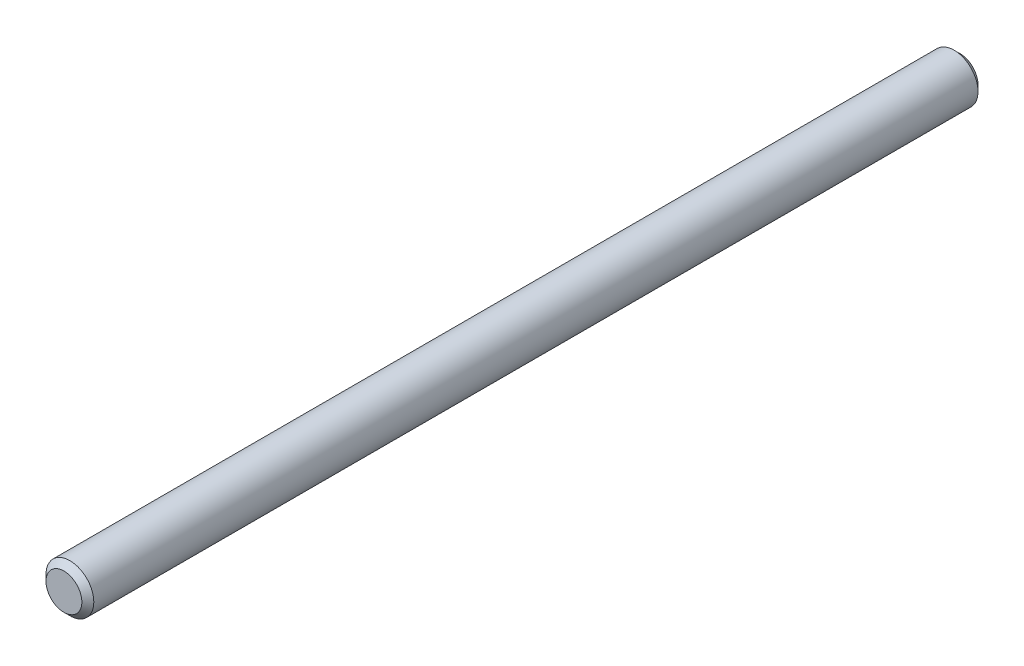
ISO-10303-21;
HEADER;
FILE_DESCRIPTION(('STEP AP214'),'2;1');
FILE_NAME('part.step','',(''),(''),'','','');
FILE_SCHEMA(('AUTOMOTIVE_DESIGN { 1 0 10303 214 1 1 1 1 }'));
ENDSEC;
DATA;
#1=APPLICATION_CONTEXT('core data for automotive mechanical design processes');
#2=APPLICATION_PROTOCOL_DEFINITION('international standard','automotive_design',2000,#1);
#3=PRODUCT_CONTEXT('',#1,'mechanical');
#4=PRODUCT('Part','Part','',(#3));
#5=PRODUCT_RELATED_PRODUCT_CATEGORY('part','',(#4));
#6=PRODUCT_DEFINITION_FORMATION('','',#4);
#7=PRODUCT_DEFINITION_CONTEXT('part definition',#1,'design');
#8=PRODUCT_DEFINITION('design','',#6,#7);
#9=PRODUCT_DEFINITION_SHAPE('','',#8);
#10=(LENGTH_UNIT() NAMED_UNIT(*) SI_UNIT(.MILLI.,.METRE.));
#11=(NAMED_UNIT(*) PLANE_ANGLE_UNIT() SI_UNIT($,.RADIAN.));
#12=(NAMED_UNIT(*) SI_UNIT($,.STERADIAN.) SOLID_ANGLE_UNIT());
#13=UNCERTAINTY_MEASURE_WITH_UNIT(LENGTH_MEASURE(1.E-05),#10,'distance_accuracy_value','');
#14=(GEOMETRIC_REPRESENTATION_CONTEXT(3) GLOBAL_UNCERTAINTY_ASSIGNED_CONTEXT((#13)) GLOBAL_UNIT_ASSIGNED_CONTEXT((#10,
#11,#12)) REPRESENTATION_CONTEXT('',''));
#15=CARTESIAN_POINT('',(0.,0.,0.));
#16=DIRECTION('',(0.,0.,1.));
#17=DIRECTION('',(1.,0.,0.));
#18=AXIS2_PLACEMENT_3D('',#15,#16,#17);
#19=CARTESIAN_POINT('',(0.,0.,150.));
#20=DIRECTION('',(0.,0.,-1.));
#21=DIRECTION('',(-1.,0.,0.));
#22=AXIS2_PLACEMENT_3D('',#19,#20,#21);
#23=CYLINDRICAL_SURFACE('',#22,4.);
#24=CARTESIAN_POINT('',(0.,0.,149.));
#25=DIRECTION('',(0.,0.,1.));
#26=DIRECTION('',(1.,0.,0.));
#27=AXIS2_PLACEMENT_3D('',#24,#25,#26);
#28=CIRCLE('',#27,4.);
#29=CARTESIAN_POINT('',(4.,0.,149.));
#30=VERTEX_POINT('',#29);
#31=EDGE_CURVE('E37',#30,#30,#28,.F.);
#32=ORIENTED_EDGE('',*,*,#31,.T.);
#33=EDGE_LOOP('',(#32));
#34=FACE_BOUND('',#33,.T.);
#35=CARTESIAN_POINT('',(0.,0.,1.));
#36=DIRECTION('',(0.,0.,1.));
#37=DIRECTION('',(1.,0.,0.));
#38=AXIS2_PLACEMENT_3D('',#35,#36,#37);
#39=CIRCLE('',#38,4.);
#40=CARTESIAN_POINT('',(4.,0.,1.));
#41=VERTEX_POINT('',#40);
#42=EDGE_CURVE('E41',#41,#41,#39,.T.);
#43=ORIENTED_EDGE('',*,*,#42,.T.);
#44=EDGE_LOOP('',(#43));
#45=FACE_BOUND('',#44,.T.);
#46=ADVANCED_FACE('F30',(#34,#45),#23,.T.);
#47=CARTESIAN_POINT('',(0.,0.,150.));
#48=DIRECTION('',(0.,0.,1.));
#49=DIRECTION('',(1.,0.,0.));
#50=AXIS2_PLACEMENT_3D('',#47,#48,#49);
#51=PLANE('',#50);
#52=CARTESIAN_POINT('',(0.,0.,150.));
#53=DIRECTION('',(0.,0.,1.));
#54=DIRECTION('',(1.,0.,0.));
#55=AXIS2_PLACEMENT_3D('',#52,#53,#54);
#56=CIRCLE('',#55,3.00000000000004);
#57=CARTESIAN_POINT('',(3.00000000000004,0.,150.));
#58=VERTEX_POINT('',#57);
#59=EDGE_CURVE('E45',#58,#58,#56,.T.);
#60=ORIENTED_EDGE('',*,*,#59,.T.);
#61=EDGE_LOOP('',(#60));
#62=FACE_BOUND('',#61,.T.);
#63=ADVANCED_FACE('F51',(#62),#51,.T.);
#64=CARTESIAN_POINT('',(0.,0.,0.));
#65=DIRECTION('',(0.,0.,1.));
#66=DIRECTION('',(1.,0.,0.));
#67=AXIS2_PLACEMENT_3D('',#64,#65,#66);
#68=PLANE('',#67);
#69=CARTESIAN_POINT('',(0.,0.,0.));
#70=DIRECTION('',(0.,0.,1.));
#71=DIRECTION('',(1.,0.,0.));
#72=AXIS2_PLACEMENT_3D('',#69,#70,#71);
#73=CIRCLE('',#72,3.);
#74=CARTESIAN_POINT('',(3.,0.,0.));
#75=VERTEX_POINT('',#74);
#76=EDGE_CURVE('E10',#75,#75,#73,.F.);
#77=ORIENTED_EDGE('',*,*,#76,.T.);
#78=EDGE_LOOP('',(#77));
#79=FACE_BOUND('',#78,.T.);
#80=ADVANCED_FACE('F55',(#79),#68,.F.);
#81=CARTESIAN_POINT('',(0.,0.,150.));
#82=DIRECTION('',(0.,0.,-1.));
#83=DIRECTION('',(-1.,0.,0.));
#84=AXIS2_PLACEMENT_3D('',#81,#82,#83);
#85=CONICAL_SURFACE('',#84,3.00000000000004,0.785398163397453);
#86=ORIENTED_EDGE('',*,*,#31,.F.);
#87=EDGE_LOOP('',(#86));
#88=FACE_BOUND('',#87,.T.);
#89=ORIENTED_EDGE('',*,*,#59,.F.);
#90=EDGE_LOOP('',(#89));
#91=FACE_BOUND('',#90,.T.);
#92=ADVANCED_FACE('F53',(#88,#91),#85,.T.);
#93=CARTESIAN_POINT('',(0.,0.,1.));
#94=DIRECTION('',(0.,0.,1.));
#95=DIRECTION('',(1.,0.,0.));
#96=AXIS2_PLACEMENT_3D('',#93,#94,#95);
#97=CONICAL_SURFACE('',#96,4.,0.785398163397447);
#98=ORIENTED_EDGE('',*,*,#76,.F.);
#99=EDGE_LOOP('',(#98));
#100=FACE_BOUND('',#99,.T.);
#101=ORIENTED_EDGE('',*,*,#42,.F.);
#102=EDGE_LOOP('',(#101));
#103=FACE_BOUND('',#102,.T.);
#104=ADVANCED_FACE('F32',(#100,#103),#97,.T.);
#105=CLOSED_SHELL('',(#46,#63,#80,#92,#104));
#106=MANIFOLD_SOLID_BREP('B2',#105);
#107=ADVANCED_BREP_SHAPE_REPRESENTATION('',(#18,#106),#14);
#108=SHAPE_DEFINITION_REPRESENTATION(#9,#107);
ENDSEC;
END-ISO-10303-21;
